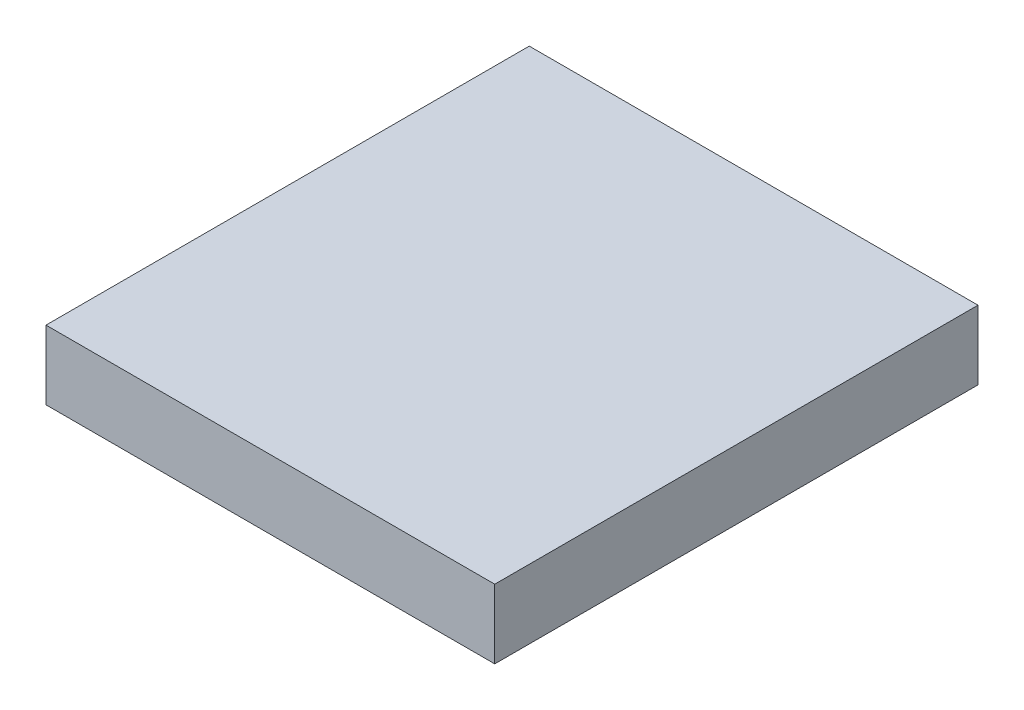
ISO-10303-21;
HEADER;
FILE_DESCRIPTION(('STEP AP214'),'2;1');
FILE_NAME('part.step','',(''),(''),'','','');
FILE_SCHEMA(('AUTOMOTIVE_DESIGN { 1 0 10303 214 1 1 1 1 }'));
ENDSEC;
DATA;
#1=APPLICATION_CONTEXT('core data for automotive mechanical design processes');
#2=APPLICATION_PROTOCOL_DEFINITION('international standard','automotive_design',2000,#1);
#3=PRODUCT_CONTEXT('',#1,'mechanical');
#4=PRODUCT('Part','Part','',(#3));
#5=PRODUCT_RELATED_PRODUCT_CATEGORY('part','',(#4));
#6=PRODUCT_DEFINITION_FORMATION('','',#4);
#7=PRODUCT_DEFINITION_CONTEXT('part definition',#1,'design');
#8=PRODUCT_DEFINITION('design','',#6,#7);
#9=PRODUCT_DEFINITION_SHAPE('','',#8);
#10=(LENGTH_UNIT() NAMED_UNIT(*) SI_UNIT(.MILLI.,.METRE.));
#11=(NAMED_UNIT(*) PLANE_ANGLE_UNIT() SI_UNIT($,.RADIAN.));
#12=(NAMED_UNIT(*) SI_UNIT($,.STERADIAN.) SOLID_ANGLE_UNIT());
#13=UNCERTAINTY_MEASURE_WITH_UNIT(LENGTH_MEASURE(1.E-05),#10,'distance_accuracy_value','');
#14=(GEOMETRIC_REPRESENTATION_CONTEXT(3) GLOBAL_UNCERTAINTY_ASSIGNED_CONTEXT((#13)) GLOBAL_UNIT_ASSIGNED_CONTEXT((#10,
#11,#12)) REPRESENTATION_CONTEXT('',''));
#15=CARTESIAN_POINT('',(0.,0.,0.));
#16=DIRECTION('',(0.,0.,1.));
#17=DIRECTION('',(1.,0.,0.));
#18=AXIS2_PLACEMENT_3D('',#15,#16,#17);
#19=CARTESIAN_POINT('',(0.,1.,0.));
#20=DIRECTION('',(1.,0.,0.));
#21=DIRECTION('',(0.,0.,-1.));
#22=AXIS2_PLACEMENT_3D('',#19,#20,#21);
#23=PLANE('',#22);
#24=DIRECTION('',(0.,0.,1.));
#25=VECTOR('',#24,1.);
#26=CARTESIAN_POINT('',(0.,0.,0.));
#27=LINE('',#26,#25);
#28=CARTESIAN_POINT('',(0.,0.,0.));
#29=VERTEX_POINT('',#28);
#30=CARTESIAN_POINT('',(0.,0.,7.));
#31=VERTEX_POINT('',#30);
#32=EDGE_CURVE('E96',#29,#31,#27,.T.);
#33=ORIENTED_EDGE('',*,*,#32,.T.);
#34=DIRECTION('',(0.,-1.,0.));
#35=VECTOR('',#34,1.);
#36=CARTESIAN_POINT('',(0.,1.,7.));
#37=LINE('',#36,#35);
#38=CARTESIAN_POINT('',(0.,1.,7.));
#39=VERTEX_POINT('',#38);
#40=EDGE_CURVE('E11',#39,#31,#37,.T.);
#41=ORIENTED_EDGE('',*,*,#40,.F.);
#42=DIRECTION('',(0.,0.,1.));
#43=VECTOR('',#42,1.);
#44=CARTESIAN_POINT('',(0.,1.,0.));
#45=LINE('',#44,#43);
#46=CARTESIAN_POINT('',(0.,1.,0.));
#47=VERTEX_POINT('',#46);
#48=EDGE_CURVE('E84',#47,#39,#45,.T.);
#49=ORIENTED_EDGE('',*,*,#48,.F.);
#50=DIRECTION('',(0.,-1.,0.));
#51=VECTOR('',#50,1.);
#52=CARTESIAN_POINT('',(0.,1.,0.));
#53=LINE('',#52,#51);
#54=EDGE_CURVE('E92',#47,#29,#53,.T.);
#55=ORIENTED_EDGE('',*,*,#54,.T.);
#56=EDGE_LOOP('',(#33,#41,#49,#55));
#57=FACE_BOUND('',#56,.T.);
#58=ADVANCED_FACE('F33',(#57),#23,.F.);
#59=CARTESIAN_POINT('',(0.,1.,7.));
#60=DIRECTION('',(0.,0.,-1.));
#61=DIRECTION('',(-1.,0.,0.));
#62=AXIS2_PLACEMENT_3D('',#59,#60,#61);
#63=PLANE('',#62);
#64=DIRECTION('',(1.,0.,0.));
#65=VECTOR('',#64,1.);
#66=CARTESIAN_POINT('',(0.,0.,7.));
#67=LINE('',#66,#65);
#68=CARTESIAN_POINT('',(6.5,0.,7.));
#69=VERTEX_POINT('',#68);
#70=EDGE_CURVE('E88',#31,#69,#67,.T.);
#71=ORIENTED_EDGE('',*,*,#70,.T.);
#72=DIRECTION('',(0.,-1.,0.));
#73=VECTOR('',#72,1.);
#74=CARTESIAN_POINT('',(6.5,1.,7.));
#75=LINE('',#74,#73);
#76=CARTESIAN_POINT('',(6.5,1.,7.));
#77=VERTEX_POINT('',#76);
#78=EDGE_CURVE('E41',#77,#69,#75,.T.);
#79=ORIENTED_EDGE('',*,*,#78,.F.);
#80=DIRECTION('',(1.,0.,0.));
#81=VECTOR('',#80,1.);
#82=CARTESIAN_POINT('',(0.,1.,7.));
#83=LINE('',#82,#81);
#84=EDGE_CURVE('E79',#39,#77,#83,.T.);
#85=ORIENTED_EDGE('',*,*,#84,.F.);
#86=ORIENTED_EDGE('',*,*,#40,.T.);
#87=EDGE_LOOP('',(#71,#79,#85,#86));
#88=FACE_BOUND('',#87,.T.);
#89=ADVANCED_FACE('F87',(#88),#63,.F.);
#90=CARTESIAN_POINT('',(6.5,1.,0.));
#91=DIRECTION('',(-1.,0.,0.));
#92=DIRECTION('',(0.,0.,1.));
#93=AXIS2_PLACEMENT_3D('',#90,#91,#92);
#94=PLANE('',#93);
#95=DIRECTION('',(0.,0.,-1.));
#96=VECTOR('',#95,1.);
#97=CARTESIAN_POINT('',(6.5,0.,0.));
#98=LINE('',#97,#96);
#99=CARTESIAN_POINT('',(6.5,0.,0.));
#100=VERTEX_POINT('',#99);
#101=EDGE_CURVE('E66',#69,#100,#98,.T.);
#102=ORIENTED_EDGE('',*,*,#101,.T.);
#103=DIRECTION('',(0.,-1.,0.));
#104=VECTOR('',#103,1.);
#105=CARTESIAN_POINT('',(6.5,1.,0.));
#106=LINE('',#105,#104);
#107=CARTESIAN_POINT('',(6.5,1.,0.));
#108=VERTEX_POINT('',#107);
#109=EDGE_CURVE('E89',#108,#100,#106,.T.);
#110=ORIENTED_EDGE('',*,*,#109,.F.);
#111=DIRECTION('',(0.,0.,-1.));
#112=VECTOR('',#111,1.);
#113=CARTESIAN_POINT('',(6.5,1.,0.));
#114=LINE('',#113,#112);
#115=EDGE_CURVE('E82',#77,#108,#114,.T.);
#116=ORIENTED_EDGE('',*,*,#115,.F.);
#117=ORIENTED_EDGE('',*,*,#78,.T.);
#118=EDGE_LOOP('',(#102,#110,#116,#117));
#119=FACE_BOUND('',#118,.T.);
#120=ADVANCED_FACE('F90',(#119),#94,.F.);
#121=CARTESIAN_POINT('',(0.,1.,0.));
#122=DIRECTION('',(0.,0.,1.));
#123=DIRECTION('',(1.,0.,0.));
#124=AXIS2_PLACEMENT_3D('',#121,#122,#123);
#125=PLANE('',#124);
#126=DIRECTION('',(-1.,0.,0.));
#127=VECTOR('',#126,1.);
#128=CARTESIAN_POINT('',(0.,0.,0.));
#129=LINE('',#128,#127);
#130=EDGE_CURVE('E72',#100,#29,#129,.T.);
#131=ORIENTED_EDGE('',*,*,#130,.T.);
#132=ORIENTED_EDGE('',*,*,#54,.F.);
#133=DIRECTION('',(-1.,0.,0.));
#134=VECTOR('',#133,1.);
#135=CARTESIAN_POINT('',(0.,1.,0.));
#136=LINE('',#135,#134);
#137=EDGE_CURVE('E49',#108,#47,#136,.T.);
#138=ORIENTED_EDGE('',*,*,#137,.F.);
#139=ORIENTED_EDGE('',*,*,#109,.T.);
#140=EDGE_LOOP('',(#131,#132,#138,#139));
#141=FACE_BOUND('',#140,.T.);
#142=ADVANCED_FACE('F103',(#141),#125,.F.);
#143=CARTESIAN_POINT('',(0.,1.,0.));
#144=DIRECTION('',(0.,1.,0.));
#145=DIRECTION('',(0.,0.,1.));
#146=AXIS2_PLACEMENT_3D('',#143,#144,#145);
#147=PLANE('',#146);
#148=ORIENTED_EDGE('',*,*,#48,.T.);
#149=ORIENTED_EDGE('',*,*,#84,.T.);
#150=ORIENTED_EDGE('',*,*,#115,.T.);
#151=ORIENTED_EDGE('',*,*,#137,.T.);
#152=EDGE_LOOP('',(#148,#149,#150,#151));
#153=FACE_BOUND('',#152,.T.);
#154=ADVANCED_FACE('F80',(#153),#147,.T.);
#155=CARTESIAN_POINT('',(0.,0.,0.));
#156=DIRECTION('',(0.,1.,0.));
#157=DIRECTION('',(0.,0.,1.));
#158=AXIS2_PLACEMENT_3D('',#155,#156,#157);
#159=PLANE('',#158);
#160=ORIENTED_EDGE('',*,*,#32,.F.);
#161=ORIENTED_EDGE('',*,*,#130,.F.);
#162=ORIENTED_EDGE('',*,*,#101,.F.);
#163=ORIENTED_EDGE('',*,*,#70,.F.);
#164=EDGE_LOOP('',(#160,#161,#162,#163));
#165=FACE_BOUND('',#164,.T.);
#166=ADVANCED_FACE('F106',(#165),#159,.F.);
#167=CLOSED_SHELL('',(#58,#89,#120,#142,#154,#166));
#168=MANIFOLD_SOLID_BREP('B2',#167);
#169=ADVANCED_BREP_SHAPE_REPRESENTATION('',(#18,#168),#14);
#170=SHAPE_DEFINITION_REPRESENTATION(#9,#169);
ENDSEC;
END-ISO-10303-21;
